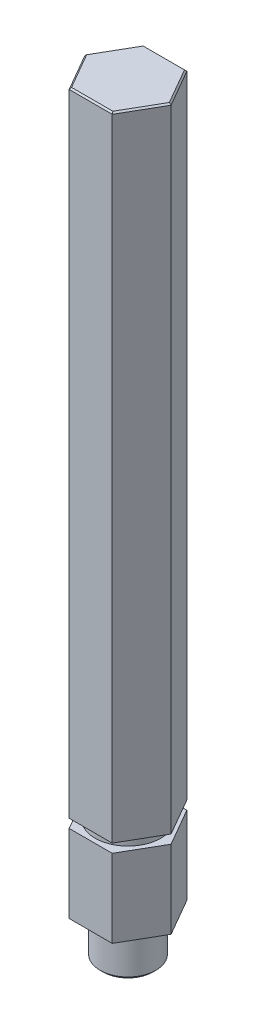
ISO-10303-21;
HEADER;
FILE_DESCRIPTION(('STEP AP214'),'2;1');
FILE_NAME('part.step','',(''),(''),'','','');
FILE_SCHEMA(('AUTOMOTIVE_DESIGN { 1 0 10303 214 1 1 1 1 }'));
ENDSEC;
DATA;
#1=APPLICATION_CONTEXT('core data for automotive mechanical design processes');
#2=APPLICATION_PROTOCOL_DEFINITION('international standard','automotive_design',2000,#1);
#3=PRODUCT_CONTEXT('',#1,'mechanical');
#4=PRODUCT('Part','Part','',(#3));
#5=PRODUCT_RELATED_PRODUCT_CATEGORY('part','',(#4));
#6=PRODUCT_DEFINITION_FORMATION('','',#4);
#7=PRODUCT_DEFINITION_CONTEXT('part definition',#1,'design');
#8=PRODUCT_DEFINITION('design','',#6,#7);
#9=PRODUCT_DEFINITION_SHAPE('','',#8);
#10=(LENGTH_UNIT() NAMED_UNIT(*) SI_UNIT(.MILLI.,.METRE.));
#11=(NAMED_UNIT(*) PLANE_ANGLE_UNIT() SI_UNIT($,.RADIAN.));
#12=(NAMED_UNIT(*) SI_UNIT($,.STERADIAN.) SOLID_ANGLE_UNIT());
#13=UNCERTAINTY_MEASURE_WITH_UNIT(LENGTH_MEASURE(1.E-05),#10,'distance_accuracy_value','');
#14=(GEOMETRIC_REPRESENTATION_CONTEXT(3) GLOBAL_UNCERTAINTY_ASSIGNED_CONTEXT((#13)) GLOBAL_UNIT_ASSIGNED_CONTEXT((#10,
#11,#12)) REPRESENTATION_CONTEXT('',''));
#15=CARTESIAN_POINT('',(0.,0.,0.));
#16=DIRECTION('',(0.,0.,1.));
#17=DIRECTION('',(1.,0.,0.));
#18=AXIS2_PLACEMENT_3D('',#15,#16,#17);
#19=CARTESIAN_POINT('',(-38.3071337161431,-19.812,-16.669011646302));
#20=DIRECTION('',(0.,-1.,0.));
#21=DIRECTION('',(0.,0.,-1.));
#22=AXIS2_PLACEMENT_3D('',#19,#20,#21);
#23=PLANE('',#22);
#24=CARTESIAN_POINT('',(-38.3071337161431,-19.812,-16.669011646302));
#25=DIRECTION('',(0.,1.,0.));
#26=DIRECTION('',(0.,0.,1.));
#27=AXIS2_PLACEMENT_3D('',#24,#25,#26);
#28=CIRCLE('',#27,3.1623);
#29=CARTESIAN_POINT('',(-38.3071337161431,-19.812,-13.506711646302));
#30=VERTEX_POINT('',#29);
#31=EDGE_CURVE('E19',#30,#30,#28,.F.);
#32=ORIENTED_EDGE('',*,*,#31,.T.);
#33=EDGE_LOOP('',(#32));
#34=FACE_BOUND('',#33,.T.);
#35=ADVANCED_FACE('F16',(#34),#23,.T.);
#36=CARTESIAN_POINT('',(-38.3071337161431,-45.212,-16.669011646302));
#37=DIRECTION('',(0.,1.,0.));
#38=DIRECTION('',(0.,0.,1.));
#39=AXIS2_PLACEMENT_3D('',#36,#37,#38);
#40=CYLINDRICAL_SURFACE('',#39,3.1623);
#41=ORIENTED_EDGE('',*,*,#31,.F.);
#42=EDGE_LOOP('',(#41));
#43=FACE_BOUND('',#42,.T.);
#44=CARTESIAN_POINT('',(-38.3071337161431,-32.2579999999562,-16.669011646302));
#45=DIRECTION('',(0.,-1.,0.));
#46=DIRECTION('',(0.,0.,-1.));
#47=AXIS2_PLACEMENT_3D('',#44,#45,#46);
#48=CIRCLE('',#47,3.16230000002623);
#49=CARTESIAN_POINT('',(-38.3071337161431,-32.2579999999562,-19.8313116463282));
#50=VERTEX_POINT('',#49);
#51=EDGE_CURVE('E154',#50,#50,#48,.T.);
#52=ORIENTED_EDGE('',*,*,#51,.T.);
#53=EDGE_LOOP('',(#52));
#54=FACE_BOUND('',#53,.T.);
#55=ADVANCED_FACE('F189',(#43,#54),#40,.F.);
#56=CARTESIAN_POINT('',(-38.3071337161431,-32.5119999999401,-16.669011646302));
#57=DIRECTION('',(0.,-1.,0.));
#58=DIRECTION('',(0.,0.,-1.));
#59=AXIS2_PLACEMENT_3D('',#56,#57,#58);
#60=CONICAL_SURFACE('',#59,3.41630000001022,0.785398163397448);
#61=CARTESIAN_POINT('',(-38.3071337161431,-32.5119999999401,-16.669011646302));
#62=DIRECTION('',(0.,-1.,0.));
#63=DIRECTION('',(0.,0.,-1.));
#64=AXIS2_PLACEMENT_3D('',#61,#62,#63);
#65=CIRCLE('',#64,3.41630000001022);
#66=CARTESIAN_POINT('',(-38.3071337161431,-32.5119999999401,-20.0853116463122));
#67=VERTEX_POINT('',#66);
#68=EDGE_CURVE('E157',#67,#67,#65,.T.);
#69=ORIENTED_EDGE('',*,*,#68,.T.);
#70=EDGE_LOOP('',(#69));
#71=FACE_BOUND('',#70,.T.);
#72=ORIENTED_EDGE('',*,*,#51,.F.);
#73=EDGE_LOOP('',(#72));
#74=FACE_BOUND('',#73,.T.);
#75=ADVANCED_FACE('F173',(#71,#74),#60,.F.);
#76=CARTESIAN_POINT('',(-38.3071337161431,-32.512,-16.669011646302));
#77=DIRECTION('',(0.,1.,0.));
#78=DIRECTION('',(0.,0.,1.));
#79=AXIS2_PLACEMENT_3D('',#76,#77,#78);
#80=PLANE('',#79);
#81=CARTESIAN_POINT('',(-38.3071337161431,-32.511999999997,-16.669011646302));
#82=DIRECTION('',(0.,1.,0.));
#83=DIRECTION('',(0.,0.,1.));
#84=AXIS2_PLACEMENT_3D('',#81,#82,#83);
#85=CIRCLE('',#84,4.24179999994759);
#86=CARTESIAN_POINT('',(-38.3071337161431,-32.511999999997,-12.4272116463544));
#87=VERTEX_POINT('',#86);
#88=EDGE_CURVE('E153',#87,#87,#85,.T.);
#89=ORIENTED_EDGE('',*,*,#88,.F.);
#90=EDGE_LOOP('',(#89));
#91=FACE_BOUND('',#90,.T.);
#92=ORIENTED_EDGE('',*,*,#68,.F.);
#93=EDGE_LOOP('',(#92));
#94=FACE_BOUND('',#93,.T.);
#95=ADVANCED_FACE('F176',(#91,#94),#80,.F.);
#96=CARTESIAN_POINT('',(-38.3071337161431,-32.0039999999722,-16.669011646302));
#97=DIRECTION('',(0.,1.,0.));
#98=DIRECTION('',(0.,0.,1.));
#99=AXIS2_PLACEMENT_3D('',#96,#97,#98);
#100=CONICAL_SURFACE('',#99,4.74979999991557,0.7853981633415);
#101=CARTESIAN_POINT('',(-38.3071337161431,-32.004,-16.669011646302));
#102=DIRECTION('',(0.,1.,0.));
#103=DIRECTION('',(0.,0.,1.));
#104=AXIS2_PLACEMENT_3D('',#101,#102,#103);
#105=CIRCLE('',#104,4.7498);
#106=CARTESIAN_POINT('',(-38.3071337161431,-32.004,-11.919211646302));
#107=VERTEX_POINT('',#106);
#108=EDGE_CURVE('E150',#107,#107,#105,.T.);
#109=ORIENTED_EDGE('',*,*,#108,.F.);
#110=EDGE_LOOP('',(#109));
#111=FACE_BOUND('',#110,.T.);
#112=ORIENTED_EDGE('',*,*,#88,.T.);
#113=EDGE_LOOP('',(#112));
#114=FACE_BOUND('',#113,.T.);
#115=ADVANCED_FACE('F178',(#111,#114),#100,.T.);
#116=CARTESIAN_POINT('',(-38.3071337161431,-32.512,-16.669011646302));
#117=DIRECTION('',(0.,1.,0.));
#118=DIRECTION('',(0.,0.,1.));
#119=AXIS2_PLACEMENT_3D('',#116,#117,#118);
#120=CYLINDRICAL_SURFACE('',#119,4.7498);
#121=CARTESIAN_POINT('',(-38.3071337161431,-25.4,-16.669011646302));
#122=DIRECTION('',(0.,1.,0.));
#123=DIRECTION('',(0.,0.,1.));
#124=AXIS2_PLACEMENT_3D('',#121,#122,#123);
#125=CIRCLE('',#124,4.7498);
#126=CARTESIAN_POINT('',(-38.3071337161431,-25.4,-11.919211646302));
#127=VERTEX_POINT('',#126);
#128=EDGE_CURVE('E132',#127,#127,#125,.F.);
#129=ORIENTED_EDGE('',*,*,#128,.T.);
#130=EDGE_LOOP('',(#129));
#131=FACE_BOUND('',#130,.T.);
#132=ORIENTED_EDGE('',*,*,#108,.T.);
#133=EDGE_LOOP('',(#132));
#134=FACE_BOUND('',#133,.T.);
#135=ADVANCED_FACE('F186',(#131,#134),#120,.T.);
#136=CARTESIAN_POINT('',(-38.3071337161431,-25.4,-3.96901164630201));
#137=DIRECTION('',(0.,1.,0.));
#138=DIRECTION('',(0.,0.,1.));
#139=AXIS2_PLACEMENT_3D('',#136,#137,#138);
#140=PLANE('',#139);
#141=DIRECTION('',(-0.5,0.,0.866025403784438));
#142=VECTOR('',#141,1.);
#143=CARTESIAN_POINT('',(-41.9733079254973,-25.4,-23.019011646302));
#144=LINE('',#143,#142);
#145=CARTESIAN_POINT('',(-41.9733079254973,-25.4,-23.019011646302));
#146=VERTEX_POINT('',#145);
#147=CARTESIAN_POINT('',(-45.6394821348514,-25.4,-16.669011646302));
#148=VERTEX_POINT('',#147);
#149=EDGE_CURVE('E124',#146,#148,#144,.T.);
#150=ORIENTED_EDGE('',*,*,#149,.F.);
#151=DIRECTION('',(-1.,0.,0.));
#152=VECTOR('',#151,1.);
#153=CARTESIAN_POINT('',(-34.640959506789,-25.4,-23.019011646302));
#154=LINE('',#153,#152);
#155=CARTESIAN_POINT('',(-34.640959506789,-25.4,-23.019011646302));
#156=VERTEX_POINT('',#155);
#157=EDGE_CURVE('E121',#156,#146,#154,.T.);
#158=ORIENTED_EDGE('',*,*,#157,.F.);
#159=DIRECTION('',(-0.5,0.,-0.866025403784438));
#160=VECTOR('',#159,1.);
#161=CARTESIAN_POINT('',(-30.9747852974349,-25.4,-16.669011646302));
#162=LINE('',#161,#160);
#163=CARTESIAN_POINT('',(-30.9747852974349,-25.4,-16.669011646302));
#164=VERTEX_POINT('',#163);
#165=EDGE_CURVE('E141',#164,#156,#162,.T.);
#166=ORIENTED_EDGE('',*,*,#165,.F.);
#167=DIRECTION('',(0.500000000000001,0.,-0.866025403784438));
#168=VECTOR('',#167,1.);
#169=CARTESIAN_POINT('',(-34.640959506789,-25.4,-10.319011646302));
#170=LINE('',#169,#168);
#171=CARTESIAN_POINT('',(-34.640959506789,-25.4,-10.319011646302));
#172=VERTEX_POINT('',#171);
#173=EDGE_CURVE('E482',#172,#164,#170,.T.);
#174=ORIENTED_EDGE('',*,*,#173,.F.);
#175=DIRECTION('',(1.,0.,0.));
#176=VECTOR('',#175,1.);
#177=CARTESIAN_POINT('',(-41.9733079254973,-25.4,-10.319011646302));
#178=LINE('',#177,#176);
#179=CARTESIAN_POINT('',(-41.9733079254973,-25.4,-10.319011646302));
#180=VERTEX_POINT('',#179);
#181=EDGE_CURVE('E487',#180,#172,#178,.T.);
#182=ORIENTED_EDGE('',*,*,#181,.F.);
#183=DIRECTION('',(0.5,0.,0.866025403784438));
#184=VECTOR('',#183,1.);
#185=CARTESIAN_POINT('',(-45.6394821348514,-25.4,-16.669011646302));
#186=LINE('',#185,#184);
#187=EDGE_CURVE('E129',#148,#180,#186,.T.);
#188=ORIENTED_EDGE('',*,*,#187,.F.);
#189=EDGE_LOOP('',(#150,#158,#166,#174,#182,#188));
#190=FACE_BOUND('',#189,.T.);
#191=ORIENTED_EDGE('',*,*,#128,.F.);
#192=EDGE_LOOP('',(#191));
#193=FACE_BOUND('',#192,.T.);
#194=ADVANCED_FACE('F126',(#190,#193),#140,.F.);
#195=CARTESIAN_POINT('',(-41.9733079254973,-25.4,-23.019011646302));
#196=DIRECTION('',(-0.866025403784438,0.,-0.5));
#197=DIRECTION('',(-0.5,0.,0.866025403784438));
#198=AXIS2_PLACEMENT_3D('',#195,#196,#197);
#199=PLANE('',#198);
#200=ORIENTED_EDGE('',*,*,#149,.T.);
#201=DIRECTION('',(0.,1.,0.));
#202=VECTOR('',#201,1.);
#203=CARTESIAN_POINT('',(-45.6394821348514,-25.4,-16.669011646302));
#204=LINE('',#203,#202);
#205=CARTESIAN_POINT('',(-45.6394821348514,-12.1158,-16.669011646302));
#206=VERTEX_POINT('',#205);
#207=EDGE_CURVE('E493',#206,#148,#204,.F.);
#208=ORIENTED_EDGE('',*,*,#207,.F.);
#209=DIRECTION('',(0.499999999999999,0.,-0.866025403784439));
#210=VECTOR('',#209,1.);
#211=CARTESIAN_POINT('',(-45.6394821348514,-12.1158,-16.669011646302));
#212=LINE('',#211,#210);
#213=CARTESIAN_POINT('',(-41.9733079254973,-12.1158,-23.019011646302));
#214=VERTEX_POINT('',#213);
#215=EDGE_CURVE('E138',#206,#214,#212,.T.);
#216=ORIENTED_EDGE('',*,*,#215,.T.);
#217=DIRECTION('',(0.,1.,0.));
#218=VECTOR('',#217,1.);
#219=CARTESIAN_POINT('',(-41.9733079254973,-25.4,-23.019011646302));
#220=LINE('',#219,#218);
#221=EDGE_CURVE('E135',#146,#214,#220,.T.);
#222=ORIENTED_EDGE('',*,*,#221,.F.);
#223=EDGE_LOOP('',(#200,#208,#216,#222));
#224=FACE_BOUND('',#223,.T.);
#225=ADVANCED_FACE('F136',(#224),#199,.T.);
#226=CARTESIAN_POINT('',(-34.640959506789,-25.4,-23.019011646302));
#227=DIRECTION('',(0.,0.,-1.));
#228=DIRECTION('',(-1.,0.,0.));
#229=AXIS2_PLACEMENT_3D('',#226,#227,#228);
#230=PLANE('',#229);
#231=ORIENTED_EDGE('',*,*,#157,.T.);
#232=ORIENTED_EDGE('',*,*,#221,.T.);
#233=DIRECTION('',(1.,0.,0.));
#234=VECTOR('',#233,1.);
#235=CARTESIAN_POINT('',(-21.7881364409388,-12.1158,-23.019011646302));
#236=LINE('',#235,#234);
#237=CARTESIAN_POINT('',(-34.640959506789,-12.1158,-23.019011646302));
#238=VERTEX_POINT('',#237);
#239=EDGE_CURVE('E504',#214,#238,#236,.T.);
#240=ORIENTED_EDGE('',*,*,#239,.T.);
#241=DIRECTION('',(0.,1.,0.));
#242=VECTOR('',#241,1.);
#243=CARTESIAN_POINT('',(-34.640959506789,-25.4,-23.019011646302));
#244=LINE('',#243,#242);
#245=EDGE_CURVE('E145',#156,#238,#244,.T.);
#246=ORIENTED_EDGE('',*,*,#245,.F.);
#247=EDGE_LOOP('',(#231,#232,#240,#246));
#248=FACE_BOUND('',#247,.T.);
#249=ADVANCED_FACE('F143',(#248),#230,.T.);
#250=CARTESIAN_POINT('',(-30.9747852974349,-25.4,-16.669011646302));
#251=DIRECTION('',(0.866025403784438,0.,-0.5));
#252=DIRECTION('',(-0.5,0.,-0.866025403784438));
#253=AXIS2_PLACEMENT_3D('',#250,#251,#252);
#254=PLANE('',#253);
#255=ORIENTED_EDGE('',*,*,#165,.T.);
#256=ORIENTED_EDGE('',*,*,#245,.T.);
#257=DIRECTION('',(0.5,0.,0.866025403784439));
#258=VECTOR('',#257,1.);
#259=CARTESIAN_POINT('',(-34.640959506789,-12.1158,-23.019011646302));
#260=LINE('',#259,#258);
#261=CARTESIAN_POINT('',(-30.9747852974349,-12.1158,-16.669011646302));
#262=VERTEX_POINT('',#261);
#263=EDGE_CURVE('E506',#238,#262,#260,.T.);
#264=ORIENTED_EDGE('',*,*,#263,.T.);
#265=DIRECTION('',(0.,1.,0.));
#266=VECTOR('',#265,1.);
#267=CARTESIAN_POINT('',(-30.9747852974349,-25.4,-16.669011646302));
#268=LINE('',#267,#266);
#269=EDGE_CURVE('E480',#164,#262,#268,.T.);
#270=ORIENTED_EDGE('',*,*,#269,.F.);
#271=EDGE_LOOP('',(#255,#256,#264,#270));
#272=FACE_BOUND('',#271,.T.);
#273=ADVANCED_FACE('F270',(#272),#254,.T.);
#274=CARTESIAN_POINT('',(-34.640959506789,-25.4,-10.319011646302));
#275=DIRECTION('',(0.866025403784438,0.,0.500000000000001));
#276=DIRECTION('',(0.500000000000001,0.,-0.866025403784438));
#277=AXIS2_PLACEMENT_3D('',#274,#275,#276);
#278=PLANE('',#277);
#279=ORIENTED_EDGE('',*,*,#173,.T.);
#280=ORIENTED_EDGE('',*,*,#269,.T.);
#281=DIRECTION('',(-0.500000000000001,0.,0.866025403784438));
#282=VECTOR('',#281,1.);
#283=CARTESIAN_POINT('',(-30.9747852974349,-12.1158,-16.669011646302));
#284=LINE('',#283,#282);
#285=CARTESIAN_POINT('',(-34.640959506789,-12.1158,-10.319011646302));
#286=VERTEX_POINT('',#285);
#287=EDGE_CURVE('E508',#262,#286,#284,.T.);
#288=ORIENTED_EDGE('',*,*,#287,.T.);
#289=DIRECTION('',(0.,1.,0.));
#290=VECTOR('',#289,1.);
#291=CARTESIAN_POINT('',(-34.640959506789,-25.4,-10.319011646302));
#292=LINE('',#291,#290);
#293=EDGE_CURVE('E490',#172,#286,#292,.T.);
#294=ORIENTED_EDGE('',*,*,#293,.F.);
#295=EDGE_LOOP('',(#279,#280,#288,#294));
#296=FACE_BOUND('',#295,.T.);
#297=ADVANCED_FACE('F266',(#296),#278,.T.);
#298=CARTESIAN_POINT('',(-41.9733079254973,-25.4,-10.319011646302));
#299=DIRECTION('',(0.,0.,1.));
#300=DIRECTION('',(1.,0.,0.));
#301=AXIS2_PLACEMENT_3D('',#298,#299,#300);
#302=PLANE('',#301);
#303=ORIENTED_EDGE('',*,*,#181,.T.);
#304=ORIENTED_EDGE('',*,*,#293,.T.);
#305=DIRECTION('',(1.,0.,0.));
#306=VECTOR('',#305,1.);
#307=CARTESIAN_POINT('',(-21.7881364409388,-12.1158,-10.319011646302));
#308=LINE('',#307,#306);
#309=CARTESIAN_POINT('',(-41.9733079254973,-12.1158,-10.319011646302));
#310=VERTEX_POINT('',#309);
#311=EDGE_CURVE('E510',#286,#310,#308,.F.);
#312=ORIENTED_EDGE('',*,*,#311,.T.);
#313=DIRECTION('',(0.,1.,0.));
#314=VECTOR('',#313,1.);
#315=CARTESIAN_POINT('',(-41.9733079254973,-25.4,-10.319011646302));
#316=LINE('',#315,#314);
#317=EDGE_CURVE('E496',#180,#310,#316,.T.);
#318=ORIENTED_EDGE('',*,*,#317,.F.);
#319=EDGE_LOOP('',(#303,#304,#312,#318));
#320=FACE_BOUND('',#319,.T.);
#321=ADVANCED_FACE('F262',(#320),#302,.T.);
#322=CARTESIAN_POINT('',(-45.6394821348514,-25.4,-16.669011646302));
#323=DIRECTION('',(-0.866025403784438,0.,0.5));
#324=DIRECTION('',(0.5,0.,0.866025403784438));
#325=AXIS2_PLACEMENT_3D('',#322,#323,#324);
#326=PLANE('',#325);
#327=ORIENTED_EDGE('',*,*,#187,.T.);
#328=ORIENTED_EDGE('',*,*,#317,.T.);
#329=DIRECTION('',(-0.5,0.,-0.866025403784439));
#330=VECTOR('',#329,1.);
#331=CARTESIAN_POINT('',(-41.9733079254973,-12.1158,-10.319011646302));
#332=LINE('',#331,#330);
#333=EDGE_CURVE('E512',#310,#206,#332,.T.);
#334=ORIENTED_EDGE('',*,*,#333,.T.);
#335=ORIENTED_EDGE('',*,*,#207,.T.);
#336=EDGE_LOOP('',(#327,#328,#334,#335));
#337=FACE_BOUND('',#336,.T.);
#338=ADVANCED_FACE('F258',(#337),#326,.T.);
#339=CARTESIAN_POINT('',(-43.5864245776138,97.0813400000005,-13.6210116463033));
#340=DIRECTION('',(0.612372435695801,-0.707106781186541,-0.353553390593277));
#341=DIRECTION('',(0.755928946018448,0.654653670707985,0.));
#342=AXIS2_PLACEMENT_3D('',#339,#340,#341);
#343=PLANE('',#342);
#344=DIRECTION('',(0.5,0.,0.866025403784438));
#345=VECTOR('',#344,1.);
#346=CARTESIAN_POINT('',(-45.6394821348514,96.8273400000004,-16.669011646302));
#347=LINE('',#346,#345);
#348=CARTESIAN_POINT('',(-41.9733079254973,96.8273400000004,-10.319011646302));
#349=VERTEX_POINT('',#348);
#350=CARTESIAN_POINT('',(-45.6394821348514,96.8273400000004,-16.669011646302));
#351=VERTEX_POINT('',#350);
#352=EDGE_CURVE('E535',#349,#351,#347,.F.);
#353=ORIENTED_EDGE('',*,*,#352,.F.);
#354=DIRECTION('',(0.377964473009223,0.654653670707992,-0.654653670707965));
#355=VECTOR('',#354,1.);
#356=CARTESIAN_POINT('',(-41.9733079254973,96.8273400000004,-10.319011646302));
#357=LINE('',#356,#355);
#358=CARTESIAN_POINT('',(-41.8266609571231,97.0813400000005,-10.573011646302));
#359=VERTEX_POINT('',#358);
#360=EDGE_CURVE('E499',#349,#359,#357,.T.);
#361=ORIENTED_EDGE('',*,*,#360,.T.);
#362=DIRECTION('',(0.5,0.,0.866025403784439));
#363=VECTOR('',#362,1.);
#364=CARTESIAN_POINT('',(-45.346188198103,97.0813400000005,-16.669011646302));
#365=LINE('',#364,#363);
#366=CARTESIAN_POINT('',(-45.346188198103,97.0813400000005,-16.669011646302));
#367=VERTEX_POINT('',#366);
#368=EDGE_CURVE('E519',#367,#359,#365,.T.);
#369=ORIENTED_EDGE('',*,*,#368,.F.);
#370=DIRECTION('',(0.755928946018443,0.65465367070799,0.));
#371=VECTOR('',#370,1.);
#372=CARTESIAN_POINT('',(-44.3406089863946,97.9521971428575,-16.669011646302));
#373=LINE('',#372,#371);
#374=EDGE_CURVE('E515',#367,#351,#373,.F.);
#375=ORIENTED_EDGE('',*,*,#374,.T.);
#376=EDGE_LOOP('',(#353,#361,#369,#375));
#377=FACE_BOUND('',#376,.T.);
#378=ADVANCED_FACE('F254',(#377),#343,.F.);
#379=CARTESIAN_POINT('',(-38.3071337161451,97.0813400000005,-10.573011646302));
#380=DIRECTION('',(0.,-0.707106781186532,-0.707106781186563));
#381=DIRECTION('',(0.,0.707106781186563,-0.707106781186532));
#382=AXIS2_PLACEMENT_3D('',#379,#380,#381);
#383=PLANE('',#382);
#384=DIRECTION('',(1.,0.,0.));
#385=VECTOR('',#384,1.);
#386=CARTESIAN_POINT('',(-41.9733079254973,96.8273400000004,-10.319011646302));
#387=LINE('',#386,#385);
#388=CARTESIAN_POINT('',(-34.640959506789,96.8273400000004,-10.319011646302));
#389=VERTEX_POINT('',#388);
#390=EDGE_CURVE('E538',#389,#349,#387,.F.);
#391=ORIENTED_EDGE('',*,*,#390,.F.);
#392=DIRECTION('',(-0.377964473009208,0.654653670707992,-0.654653670707974));
#393=VECTOR('',#392,1.);
#394=CARTESIAN_POINT('',(-34.640959506789,96.8273400000004,-10.319011646302));
#395=LINE('',#394,#393);
#396=CARTESIAN_POINT('',(-34.7876064751632,97.0813400000005,-10.573011646302));
#397=VERTEX_POINT('',#396);
#398=EDGE_CURVE('E501',#389,#397,#395,.T.);
#399=ORIENTED_EDGE('',*,*,#398,.T.);
#400=DIRECTION('',(1.,0.,0.));
#401=VECTOR('',#400,1.);
#402=CARTESIAN_POINT('',(-38.3071337161451,97.0813400000005,-10.573011646302));
#403=LINE('',#402,#401);
#404=EDGE_CURVE('E522',#359,#397,#403,.T.);
#405=ORIENTED_EDGE('',*,*,#404,.F.);
#406=ORIENTED_EDGE('',*,*,#360,.F.);
#407=EDGE_LOOP('',(#391,#399,#405,#406));
#408=FACE_BOUND('',#407,.T.);
#409=ADVANCED_FACE('F250',(#408),#383,.F.);
#410=CARTESIAN_POINT('',(-33.0278428546735,97.0813400000005,-13.6210116463016));
#411=DIRECTION('',(-0.61237243569581,-0.70710678118653,-0.353553390593283));
#412=DIRECTION('',(0.755928946018438,-0.654653670707996,0.));
#413=AXIS2_PLACEMENT_3D('',#410,#411,#412);
#414=PLANE('',#413);
#415=DIRECTION('',(0.500000000000001,0.,-0.866025403784438));
#416=VECTOR('',#415,1.);
#417=CARTESIAN_POINT('',(-34.7876064751632,97.0813400000005,-10.573011646302));
#418=LINE('',#417,#416);
#419=CARTESIAN_POINT('',(-31.2680792341832,97.0813400000005,-16.669011646302));
#420=VERTEX_POINT('',#419);
#421=EDGE_CURVE('E525',#397,#420,#418,.T.);
#422=ORIENTED_EDGE('',*,*,#421,.F.);
#423=ORIENTED_EDGE('',*,*,#398,.F.);
#424=DIRECTION('',(0.500000000000001,0.,-0.866025403784438));
#425=VECTOR('',#424,1.);
#426=CARTESIAN_POINT('',(-34.640959506789,96.8273400000004,-10.319011646302));
#427=LINE('',#426,#425);
#428=CARTESIAN_POINT('',(-30.9747852974349,96.8273400000004,-16.669011646302));
#429=VERTEX_POINT('',#428);
#430=EDGE_CURVE('E544',#429,#389,#427,.F.);
#431=ORIENTED_EDGE('',*,*,#430,.F.);
#432=DIRECTION('',(0.755928946018442,-0.654653670707992,0.));
#433=VECTOR('',#432,1.);
#434=CARTESIAN_POINT('',(-32.2736584458922,97.952197142858,-16.669011646302));
#435=LINE('',#434,#433);
#436=EDGE_CURVE('E531',#429,#420,#435,.F.);
#437=ORIENTED_EDGE('',*,*,#436,.T.);
#438=EDGE_LOOP('',(#422,#423,#431,#437));
#439=FACE_BOUND('',#438,.T.);
#440=ADVANCED_FACE('F246',(#439),#414,.F.);
#441=CARTESIAN_POINT('',(-21.7881364409388,-12.1158,-16.669011646302));
#442=DIRECTION('',(0.,-1.,0.));
#443=DIRECTION('',(0.,0.,-1.));
#444=AXIS2_PLACEMENT_3D('',#441,#442,#443);
#445=PLANE('',#444);
#446=ORIENTED_EDGE('',*,*,#311,.F.);
#447=ORIENTED_EDGE('',*,*,#287,.F.);
#448=ORIENTED_EDGE('',*,*,#263,.F.);
#449=ORIENTED_EDGE('',*,*,#239,.F.);
#450=ORIENTED_EDGE('',*,*,#215,.F.);
#451=ORIENTED_EDGE('',*,*,#333,.F.);
#452=EDGE_LOOP('',(#446,#447,#448,#449,#450,#451));
#453=FACE_BOUND('',#452,.T.);
#454=CARTESIAN_POINT('',(-38.3071337161431,-12.1158,-16.669011646302));
#455=DIRECTION('',(0.,1.,0.));
#456=DIRECTION('',(0.,0.,1.));
#457=AXIS2_PLACEMENT_3D('',#454,#455,#456);
#458=CIRCLE('',#457,5.58800000000003);
#459=CARTESIAN_POINT('',(-38.3071337161431,-12.1158,-11.081011646302));
#460=VERTEX_POINT('',#459);
#461=EDGE_CURVE('E162',#460,#460,#458,.T.);
#462=ORIENTED_EDGE('',*,*,#461,.F.);
#463=EDGE_LOOP('',(#462));
#464=FACE_BOUND('',#463,.T.);
#465=ADVANCED_FACE('F242',(#453,#464),#445,.F.);
#466=CARTESIAN_POINT('',(-43.5864245776133,97.0813400000005,-19.7170116463016));
#467=DIRECTION('',(0.612372435695805,-0.707106781186535,0.353553390593281));
#468=DIRECTION('',(0.755928946018443,0.65465367070799,0.));
#469=AXIS2_PLACEMENT_3D('',#466,#467,#468);
#470=PLANE('',#469);
#471=DIRECTION('',(-0.5,0.,0.866025403784438));
#472=VECTOR('',#471,1.);
#473=CARTESIAN_POINT('',(-41.9733079254973,96.8273400000004,-23.019011646302));
#474=LINE('',#473,#472);
#475=CARTESIAN_POINT('',(-41.9733079254973,96.8273400000004,-23.019011646302));
#476=VERTEX_POINT('',#475);
#477=EDGE_CURVE('E551',#351,#476,#474,.F.);
#478=ORIENTED_EDGE('',*,*,#477,.F.);
#479=ORIENTED_EDGE('',*,*,#374,.F.);
#480=DIRECTION('',(-0.500000000000001,0.,0.866025403784438));
#481=VECTOR('',#480,1.);
#482=CARTESIAN_POINT('',(-41.8266609571231,97.0813400000005,-22.765011646302));
#483=LINE('',#482,#481);
#484=CARTESIAN_POINT('',(-41.8266609571231,97.0813400000005,-22.765011646302));
#485=VERTEX_POINT('',#484);
#486=EDGE_CURVE('E528',#485,#367,#483,.T.);
#487=ORIENTED_EDGE('',*,*,#486,.F.);
#488=DIRECTION('',(0.377964473009243,0.65465367070799,0.654653670707955));
#489=VECTOR('',#488,1.);
#490=CARTESIAN_POINT('',(-41.9733079254973,96.8273400000004,-23.019011646302));
#491=LINE('',#490,#489);
#492=EDGE_CURVE('E517',#476,#485,#491,.T.);
#493=ORIENTED_EDGE('',*,*,#492,.F.);
#494=EDGE_LOOP('',(#478,#479,#487,#493));
#495=FACE_BOUND('',#494,.T.);
#496=ADVANCED_FACE('F238',(#495),#470,.F.);
#497=CARTESIAN_POINT('',(-38.3071337161451,97.0813400000005,-16.6690116463026));
#498=DIRECTION('',(0.,1.,0.));
#499=DIRECTION('',(0.,0.,1.));
#500=AXIS2_PLACEMENT_3D('',#497,#498,#499);
#501=PLANE('',#500);
#502=DIRECTION('',(1.,0.,0.));
#503=VECTOR('',#502,1.);
#504=CARTESIAN_POINT('',(-38.3071337161451,97.0813400000005,-22.765011646302));
#505=LINE('',#504,#503);
#506=CARTESIAN_POINT('',(-34.7876064751632,97.0813400000005,-22.765011646302));
#507=VERTEX_POINT('',#506);
#508=EDGE_CURVE('E554',#507,#485,#505,.F.);
#509=ORIENTED_EDGE('',*,*,#508,.T.);
#510=ORIENTED_EDGE('',*,*,#486,.T.);
#511=ORIENTED_EDGE('',*,*,#368,.T.);
#512=ORIENTED_EDGE('',*,*,#404,.T.);
#513=ORIENTED_EDGE('',*,*,#421,.T.);
#514=DIRECTION('',(-0.499999999999999,0.,-0.866025403784439));
#515=VECTOR('',#514,1.);
#516=CARTESIAN_POINT('',(-31.2680792341832,97.0813400000005,-16.669011646302));
#517=LINE('',#516,#515);
#518=EDGE_CURVE('E533',#420,#507,#517,.T.);
#519=ORIENTED_EDGE('',*,*,#518,.T.);
#520=EDGE_LOOP('',(#509,#510,#511,#512,#513,#519));
#521=FACE_BOUND('',#520,.T.);
#522=ADVANCED_FACE('F234',(#521),#501,.T.);
#523=CARTESIAN_POINT('',(-33.0278428546739,97.0813400000005,-19.7170116463033));
#524=DIRECTION('',(-0.612372435695806,-0.707106781186534,0.353553390593281));
#525=DIRECTION('',(0.755928946018442,-0.654653670707992,0.));
#526=AXIS2_PLACEMENT_3D('',#523,#524,#525);
#527=PLANE('',#526);
#528=ORIENTED_EDGE('',*,*,#518,.F.);
#529=ORIENTED_EDGE('',*,*,#436,.F.);
#530=DIRECTION('',(-0.5,0.,-0.866025403784438));
#531=VECTOR('',#530,1.);
#532=CARTESIAN_POINT('',(-30.9747852974349,96.8273400000004,-16.669011646302));
#533=LINE('',#532,#531);
#534=CARTESIAN_POINT('',(-34.640959506789,96.8273400000004,-23.019011646302));
#535=VERTEX_POINT('',#534);
#536=EDGE_CURVE('E560',#535,#429,#533,.F.);
#537=ORIENTED_EDGE('',*,*,#536,.F.);
#538=DIRECTION('',(-0.377964473009221,0.654653670707979,0.654653670707979));
#539=VECTOR('',#538,1.);
#540=CARTESIAN_POINT('',(-34.640959506789,96.8273400000004,-23.019011646302));
#541=LINE('',#540,#539);
#542=EDGE_CURVE('E557',#535,#507,#541,.T.);
#543=ORIENTED_EDGE('',*,*,#542,.T.);
#544=EDGE_LOOP('',(#528,#529,#537,#543));
#545=FACE_BOUND('',#544,.T.);
#546=ADVANCED_FACE('F230',(#545),#527,.F.);
#547=CARTESIAN_POINT('',(-45.6394821348514,-25.4,-16.669011646302));
#548=DIRECTION('',(-0.866025403784438,0.,0.5));
#549=DIRECTION('',(0.5,0.,0.866025403784438));
#550=AXIS2_PLACEMENT_3D('',#547,#548,#549);
#551=PLANE('',#550);
#552=DIRECTION('',(0.,1.,0.));
#553=VECTOR('',#552,1.);
#554=CARTESIAN_POINT('',(-45.6394821348514,-25.4,-16.669011646302));
#555=LINE('',#554,#553);
#556=CARTESIAN_POINT('',(-45.6394821348514,-10.6172,-16.669011646302));
#557=VERTEX_POINT('',#556);
#558=EDGE_CURVE('E165',#557,#351,#555,.T.);
#559=ORIENTED_EDGE('',*,*,#558,.F.);
#560=DIRECTION('',(0.5,0.,0.866025403784439));
#561=VECTOR('',#560,1.);
#562=CARTESIAN_POINT('',(-45.6394821348514,-10.6172,-16.669011646302));
#563=LINE('',#562,#561);
#564=CARTESIAN_POINT('',(-41.9733079254973,-10.6172,-10.319011646302));
#565=VERTEX_POINT('',#564);
#566=EDGE_CURVE('E568',#557,#565,#563,.T.);
#567=ORIENTED_EDGE('',*,*,#566,.T.);
#568=DIRECTION('',(0.,1.,0.));
#569=VECTOR('',#568,1.);
#570=CARTESIAN_POINT('',(-41.9733079254973,-25.4,-10.319011646302));
#571=LINE('',#570,#569);
#572=EDGE_CURVE('E541',#349,#565,#571,.F.);
#573=ORIENTED_EDGE('',*,*,#572,.F.);
#574=ORIENTED_EDGE('',*,*,#352,.T.);
#575=EDGE_LOOP('',(#559,#567,#573,#574));
#576=FACE_BOUND('',#575,.T.);
#577=ADVANCED_FACE('F226',(#576),#551,.T.);
#578=CARTESIAN_POINT('',(-41.9733079254973,-25.4,-10.319011646302));
#579=DIRECTION('',(0.,0.,1.));
#580=DIRECTION('',(1.,0.,0.));
#581=AXIS2_PLACEMENT_3D('',#578,#579,#580);
#582=PLANE('',#581);
#583=ORIENTED_EDGE('',*,*,#572,.T.);
#584=DIRECTION('',(1.,0.,0.));
#585=VECTOR('',#584,1.);
#586=CARTESIAN_POINT('',(-32.7191337161431,-10.6172,-10.319011646302));
#587=LINE('',#586,#585);
#588=CARTESIAN_POINT('',(-34.640959506789,-10.6172,-10.319011646302));
#589=VERTEX_POINT('',#588);
#590=EDGE_CURVE('E570',#565,#589,#587,.T.);
#591=ORIENTED_EDGE('',*,*,#590,.T.);
#592=DIRECTION('',(0.,1.,0.));
#593=VECTOR('',#592,1.);
#594=CARTESIAN_POINT('',(-34.640959506789,-25.4,-10.319011646302));
#595=LINE('',#594,#593);
#596=EDGE_CURVE('E166',#389,#589,#595,.F.);
#597=ORIENTED_EDGE('',*,*,#596,.F.);
#598=ORIENTED_EDGE('',*,*,#390,.T.);
#599=EDGE_LOOP('',(#583,#591,#597,#598));
#600=FACE_BOUND('',#599,.T.);
#601=ADVANCED_FACE('F222',(#600),#582,.T.);
#602=CARTESIAN_POINT('',(-34.640959506789,-25.4,-10.319011646302));
#603=DIRECTION('',(0.866025403784438,0.,0.500000000000001));
#604=DIRECTION('',(0.500000000000001,0.,-0.866025403784438));
#605=AXIS2_PLACEMENT_3D('',#602,#603,#604);
#606=PLANE('',#605);
#607=ORIENTED_EDGE('',*,*,#596,.T.);
#608=DIRECTION('',(0.500000000000001,0.,-0.866025403784438));
#609=VECTOR('',#608,1.);
#610=CARTESIAN_POINT('',(-34.640959506789,-10.6172,-10.319011646302));
#611=LINE('',#610,#609);
#612=CARTESIAN_POINT('',(-30.9747852974349,-10.6172,-16.669011646302));
#613=VERTEX_POINT('',#612);
#614=EDGE_CURVE('E572',#589,#613,#611,.T.);
#615=ORIENTED_EDGE('',*,*,#614,.T.);
#616=DIRECTION('',(0.,1.,0.));
#617=VECTOR('',#616,1.);
#618=CARTESIAN_POINT('',(-30.9747852974349,-25.4,-16.669011646302));
#619=LINE('',#618,#617);
#620=EDGE_CURVE('E563',#429,#613,#619,.F.);
#621=ORIENTED_EDGE('',*,*,#620,.F.);
#622=ORIENTED_EDGE('',*,*,#430,.T.);
#623=EDGE_LOOP('',(#607,#615,#621,#622));
#624=FACE_BOUND('',#623,.T.);
#625=ADVANCED_FACE('F218',(#624),#606,.T.);
#626=CARTESIAN_POINT('',(-38.3071337161431,-25.4,-16.669011646302));
#627=DIRECTION('',(0.,1.,0.));
#628=DIRECTION('',(0.,0.,1.));
#629=AXIS2_PLACEMENT_3D('',#626,#627,#628);
#630=CYLINDRICAL_SURFACE('',#629,5.58800000000003);
#631=CARTESIAN_POINT('',(-38.3071337161431,-10.6172,-16.669011646302));
#632=DIRECTION('',(0.,1.,0.));
#633=DIRECTION('',(0.,0.,1.));
#634=AXIS2_PLACEMENT_3D('',#631,#632,#633);
#635=CIRCLE('',#634,5.58800000000003);
#636=CARTESIAN_POINT('',(-38.3071337161431,-10.6172,-11.081011646302));
#637=VERTEX_POINT('',#636);
#638=EDGE_CURVE('E158',#637,#637,#635,.F.);
#639=ORIENTED_EDGE('',*,*,#638,.T.);
#640=EDGE_LOOP('',(#639));
#641=FACE_BOUND('',#640,.T.);
#642=ORIENTED_EDGE('',*,*,#461,.T.);
#643=EDGE_LOOP('',(#642));
#644=FACE_BOUND('',#643,.T.);
#645=ADVANCED_FACE('F214',(#641,#644),#630,.T.);
#646=CARTESIAN_POINT('',(-41.9733079254973,-25.4,-23.019011646302));
#647=DIRECTION('',(-0.866025403784438,0.,-0.5));
#648=DIRECTION('',(-0.5,0.,0.866025403784438));
#649=AXIS2_PLACEMENT_3D('',#646,#647,#648);
#650=PLANE('',#649);
#651=DIRECTION('',(0.,1.,0.));
#652=VECTOR('',#651,1.);
#653=CARTESIAN_POINT('',(-41.9733079254973,-25.4,-23.019011646302));
#654=LINE('',#653,#652);
#655=CARTESIAN_POINT('',(-41.9733079254973,-10.6172,-23.019011646302));
#656=VERTEX_POINT('',#655);
#657=EDGE_CURVE('E161',#656,#476,#654,.T.);
#658=ORIENTED_EDGE('',*,*,#657,.F.);
#659=DIRECTION('',(-0.5,0.,0.866025403784439));
#660=VECTOR('',#659,1.);
#661=CARTESIAN_POINT('',(-41.9733079254973,-10.6172,-23.019011646302));
#662=LINE('',#661,#660);
#663=EDGE_CURVE('E565',#656,#557,#662,.T.);
#664=ORIENTED_EDGE('',*,*,#663,.T.);
#665=ORIENTED_EDGE('',*,*,#558,.T.);
#666=ORIENTED_EDGE('',*,*,#477,.T.);
#667=EDGE_LOOP('',(#658,#664,#665,#666));
#668=FACE_BOUND('',#667,.T.);
#669=ADVANCED_FACE('F210',(#668),#650,.T.);
#670=CARTESIAN_POINT('',(-38.3071337161451,97.0813400000005,-22.765011646302));
#671=DIRECTION('',(0.,-0.707106781186541,0.707106781186554));
#672=DIRECTION('',(0.,-0.707106781186554,-0.707106781186541));
#673=AXIS2_PLACEMENT_3D('',#670,#671,#672);
#674=PLANE('',#673);
#675=DIRECTION('',(-1.,0.,0.));
#676=VECTOR('',#675,1.);
#677=CARTESIAN_POINT('',(-34.640959506789,96.8273400000004,-23.019011646302));
#678=LINE('',#677,#676);
#679=EDGE_CURVE('E577',#476,#535,#678,.F.);
#680=ORIENTED_EDGE('',*,*,#679,.F.);
#681=ORIENTED_EDGE('',*,*,#492,.T.);
#682=ORIENTED_EDGE('',*,*,#508,.F.);
#683=ORIENTED_EDGE('',*,*,#542,.F.);
#684=EDGE_LOOP('',(#680,#681,#682,#683));
#685=FACE_BOUND('',#684,.T.);
#686=ADVANCED_FACE('F207',(#685),#674,.F.);
#687=CARTESIAN_POINT('',(-30.9747852974349,-25.4,-16.669011646302));
#688=DIRECTION('',(0.866025403784438,0.,-0.5));
#689=DIRECTION('',(-0.5,0.,-0.866025403784438));
#690=AXIS2_PLACEMENT_3D('',#687,#688,#689);
#691=PLANE('',#690);
#692=ORIENTED_EDGE('',*,*,#620,.T.);
#693=DIRECTION('',(-0.5,0.,-0.866025403784439));
#694=VECTOR('',#693,1.);
#695=CARTESIAN_POINT('',(-30.9747852974349,-10.6172,-16.669011646302));
#696=LINE('',#695,#694);
#697=CARTESIAN_POINT('',(-34.640959506789,-10.6172,-23.019011646302));
#698=VERTEX_POINT('',#697);
#699=EDGE_CURVE('E34',#613,#698,#696,.T.);
#700=ORIENTED_EDGE('',*,*,#699,.T.);
#701=DIRECTION('',(0.,1.,0.));
#702=VECTOR('',#701,1.);
#703=CARTESIAN_POINT('',(-34.640959506789,-25.4,-23.019011646302));
#704=LINE('',#703,#702);
#705=EDGE_CURVE('E25',#535,#698,#704,.F.);
#706=ORIENTED_EDGE('',*,*,#705,.F.);
#707=ORIENTED_EDGE('',*,*,#536,.T.);
#708=EDGE_LOOP('',(#692,#700,#706,#707));
#709=FACE_BOUND('',#708,.T.);
#710=ADVANCED_FACE('F200',(#709),#691,.T.);
#711=CARTESIAN_POINT('',(-32.7191337161431,-10.6172,-16.669011646302));
#712=DIRECTION('',(0.,1.,0.));
#713=DIRECTION('',(0.,0.,1.));
#714=AXIS2_PLACEMENT_3D('',#711,#712,#713);
#715=PLANE('',#714);
#716=ORIENTED_EDGE('',*,*,#638,.F.);
#717=EDGE_LOOP('',(#716));
#718=FACE_BOUND('',#717,.T.);
#719=ORIENTED_EDGE('',*,*,#614,.F.);
#720=ORIENTED_EDGE('',*,*,#590,.F.);
#721=ORIENTED_EDGE('',*,*,#566,.F.);
#722=ORIENTED_EDGE('',*,*,#663,.F.);
#723=DIRECTION('',(-1.,0.,0.));
#724=VECTOR('',#723,1.);
#725=CARTESIAN_POINT('',(-34.640959506789,-10.6172,-23.019011646302));
#726=LINE('',#725,#724);
#727=EDGE_CURVE('E11',#698,#656,#726,.T.);
#728=ORIENTED_EDGE('',*,*,#727,.F.);
#729=ORIENTED_EDGE('',*,*,#699,.F.);
#730=EDGE_LOOP('',(#719,#720,#721,#722,#728,#729));
#731=FACE_BOUND('',#730,.T.);
#732=ADVANCED_FACE('F194',(#718,#731),#715,.F.);
#733=CARTESIAN_POINT('',(-34.640959506789,-25.4,-23.019011646302));
#734=DIRECTION('',(0.,0.,-1.));
#735=DIRECTION('',(-1.,0.,0.));
#736=AXIS2_PLACEMENT_3D('',#733,#734,#735);
#737=PLANE('',#736);
#738=ORIENTED_EDGE('',*,*,#705,.T.);
#739=ORIENTED_EDGE('',*,*,#727,.T.);
#740=ORIENTED_EDGE('',*,*,#657,.T.);
#741=ORIENTED_EDGE('',*,*,#679,.T.);
#742=EDGE_LOOP('',(#738,#739,#740,#741));
#743=FACE_BOUND('',#742,.T.);
#744=ADVANCED_FACE('F192',(#743),#737,.T.);
#745=CLOSED_SHELL('',(#35,#55,#75,#95,#115,#135,#194,#225,#249,#273,#297,#321,#338,#378,#409,
#440,#465,#496,#522,#546,#577,#601,#625,#645,#669,#686,#710,#732,#744));
#746=MANIFOLD_SOLID_BREP('B1',#745);
#747=ADVANCED_BREP_SHAPE_REPRESENTATION('',(#18,#746),#14);
#748=SHAPE_DEFINITION_REPRESENTATION(#9,#747);
ENDSEC;
END-ISO-10303-21;
